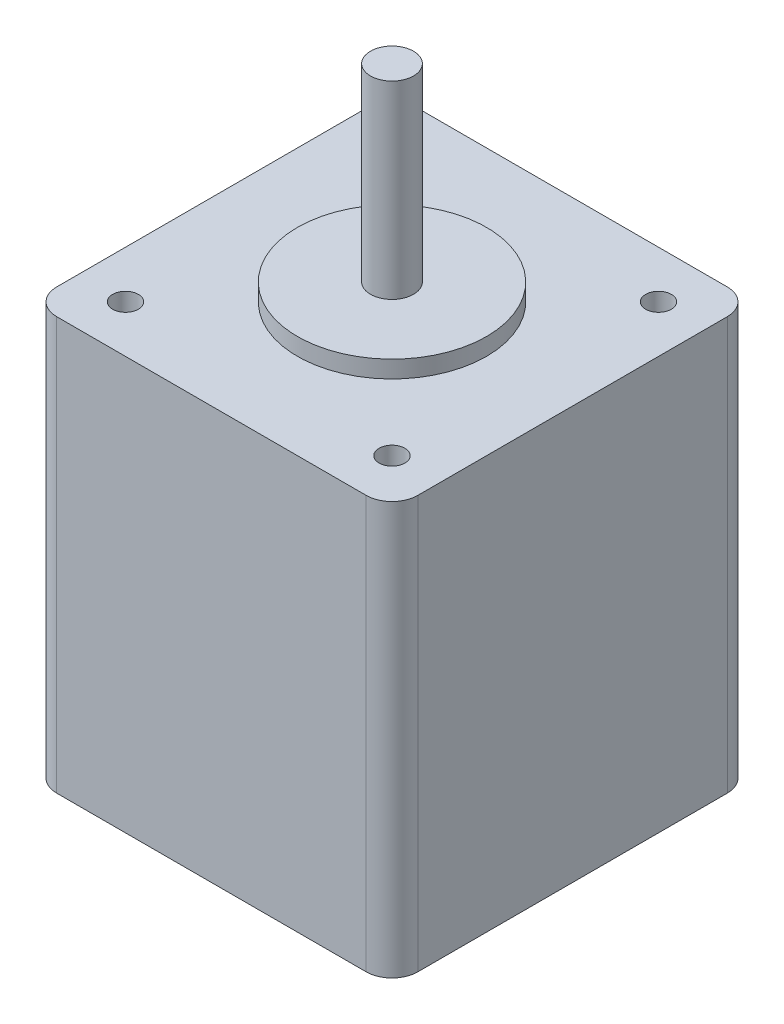
ISO-10303-21;
HEADER;
FILE_DESCRIPTION(('STEP AP214'),'2;1');
FILE_NAME('part.step','',(''),(''),'','','');
FILE_SCHEMA(('AUTOMOTIVE_DESIGN { 1 0 10303 214 1 1 1 1 }'));
ENDSEC;
DATA;
#1=APPLICATION_CONTEXT('core data for automotive mechanical design processes');
#2=APPLICATION_PROTOCOL_DEFINITION('international standard','automotive_design',2000,#1);
#3=PRODUCT_CONTEXT('',#1,'mechanical');
#4=PRODUCT('Part','Part','',(#3));
#5=PRODUCT_RELATED_PRODUCT_CATEGORY('part','',(#4));
#6=PRODUCT_DEFINITION_FORMATION('','',#4);
#7=PRODUCT_DEFINITION_CONTEXT('part definition',#1,'design');
#8=PRODUCT_DEFINITION('design','',#6,#7);
#9=PRODUCT_DEFINITION_SHAPE('','',#8);
#10=(LENGTH_UNIT() NAMED_UNIT(*) SI_UNIT(.MILLI.,.METRE.));
#11=(NAMED_UNIT(*) PLANE_ANGLE_UNIT() SI_UNIT($,.RADIAN.));
#12=(NAMED_UNIT(*) SI_UNIT($,.STERADIAN.) SOLID_ANGLE_UNIT());
#13=UNCERTAINTY_MEASURE_WITH_UNIT(LENGTH_MEASURE(1.E-05),#10,'distance_accuracy_value','');
#14=(GEOMETRIC_REPRESENTATION_CONTEXT(3) GLOBAL_UNCERTAINTY_ASSIGNED_CONTEXT((#13)) GLOBAL_UNIT_ASSIGNED_CONTEXT((#10,
#11,#12)) REPRESENTATION_CONTEXT('',''));
#15=CARTESIAN_POINT('',(0.,0.,0.));
#16=DIRECTION('',(0.,0.,1.));
#17=DIRECTION('',(1.,0.,0.));
#18=AXIS2_PLACEMENT_3D('',#15,#16,#17);
#19=CARTESIAN_POINT('',(0.,48.,0.));
#20=DIRECTION('',(0.,1.,0.));
#21=DIRECTION('',(1.,0.,0.));
#22=AXIS2_PLACEMENT_3D('',#19,#20,#21);
#23=PLANE('',#22);
#24=CARTESIAN_POINT('',(0.,48.,0.));
#25=DIRECTION('',(0.,-1.,0.));
#26=DIRECTION('',(-1.,0.,0.));
#27=AXIS2_PLACEMENT_3D('',#24,#25,#26);
#28=CIRCLE('',#27,11.);
#29=CARTESIAN_POINT('',(11.,48.,0.));
#30=VERTEX_POINT('',#29);
#31=EDGE_CURVE('E180',#30,#30,#28,.T.);
#32=ORIENTED_EDGE('',*,*,#31,.T.);
#33=EDGE_LOOP('',(#32));
#34=FACE_BOUND('',#33,.T.);
#35=CARTESIAN_POINT('',(-15.4999999999997,48.,15.4999999999997));
#36=DIRECTION('',(0.,-1.,0.));
#37=DIRECTION('',(-1.,0.,0.));
#38=AXIS2_PLACEMENT_3D('',#35,#36,#37);
#39=CIRCLE('',#38,1.5);
#40=CARTESIAN_POINT('',(-13.9999999999997,48.,15.4999999999997));
#41=VERTEX_POINT('',#40);
#42=EDGE_CURVE('E244',#41,#41,#39,.T.);
#43=ORIENTED_EDGE('',*,*,#42,.T.);
#44=EDGE_LOOP('',(#43));
#45=FACE_BOUND('',#44,.T.);
#46=CARTESIAN_POINT('',(15.5,48.,15.5));
#47=DIRECTION('',(0.,-1.,0.));
#48=DIRECTION('',(-1.,0.,0.));
#49=AXIS2_PLACEMENT_3D('',#46,#47,#48);
#50=CIRCLE('',#49,1.5);
#51=CARTESIAN_POINT('',(17.,48.,15.5));
#52=VERTEX_POINT('',#51);
#53=EDGE_CURVE('E156',#52,#52,#50,.T.);
#54=ORIENTED_EDGE('',*,*,#53,.T.);
#55=EDGE_LOOP('',(#54));
#56=FACE_BOUND('',#55,.T.);
#57=CARTESIAN_POINT('',(-15.5,48.,-15.5));
#58=DIRECTION('',(0.,-1.,0.));
#59=DIRECTION('',(-1.,0.,0.));
#60=AXIS2_PLACEMENT_3D('',#57,#58,#59);
#61=CIRCLE('',#60,1.5);
#62=CARTESIAN_POINT('',(-14.,48.,-15.5));
#63=VERTEX_POINT('',#62);
#64=EDGE_CURVE('E237',#63,#63,#61,.T.);
#65=ORIENTED_EDGE('',*,*,#64,.T.);
#66=EDGE_LOOP('',(#65));
#67=FACE_BOUND('',#66,.T.);
#68=CARTESIAN_POINT('',(15.4999999999997,48.,-15.4999999999997));
#69=DIRECTION('',(0.,-1.,0.));
#70=DIRECTION('',(-1.,0.,0.));
#71=AXIS2_PLACEMENT_3D('',#68,#69,#70);
#72=CIRCLE('',#71,1.5);
#73=CARTESIAN_POINT('',(16.9999999999997,48.,-15.4999999999997));
#74=VERTEX_POINT('',#73);
#75=EDGE_CURVE('E214',#74,#74,#72,.T.);
#76=ORIENTED_EDGE('',*,*,#75,.T.);
#77=EDGE_LOOP('',(#76));
#78=FACE_BOUND('',#77,.T.);
#79=CARTESIAN_POINT('',(-18.,48.,-18.));
#80=DIRECTION('',(0.,-1.,0.));
#81=DIRECTION('',(-0.707106781186547,0.,-0.707106781186548));
#82=AXIS2_PLACEMENT_3D('',#79,#80,#81);
#83=CIRCLE('',#82,3.);
#84=CARTESIAN_POINT('',(-21.,48.,-18.));
#85=VERTEX_POINT('',#84);
#86=CARTESIAN_POINT('',(-18.,48.,-21.));
#87=VERTEX_POINT('',#86);
#88=EDGE_CURVE('E261',#85,#87,#83,.T.);
#89=ORIENTED_EDGE('',*,*,#88,.F.);
#90=DIRECTION('',(0.,0.,1.));
#91=VECTOR('',#90,1.);
#92=CARTESIAN_POINT('',(-21.,48.,21.));
#93=LINE('',#92,#91);
#94=CARTESIAN_POINT('',(-21.,48.,18.));
#95=VERTEX_POINT('',#94);
#96=EDGE_CURVE('E245',#85,#95,#93,.T.);
#97=ORIENTED_EDGE('',*,*,#96,.T.);
#98=CARTESIAN_POINT('',(-18.,48.,18.));
#99=DIRECTION('',(0.,-1.,0.));
#100=DIRECTION('',(-0.707106781186548,0.,0.707106781186548));
#101=AXIS2_PLACEMENT_3D('',#98,#99,#100);
#102=CIRCLE('',#101,3.);
#103=CARTESIAN_POINT('',(-18.,48.,21.));
#104=VERTEX_POINT('',#103);
#105=EDGE_CURVE('E263',#104,#95,#102,.T.);
#106=ORIENTED_EDGE('',*,*,#105,.F.);
#107=DIRECTION('',(1.,0.,0.));
#108=VECTOR('',#107,1.);
#109=CARTESIAN_POINT('',(21.,48.,21.));
#110=LINE('',#109,#108);
#111=CARTESIAN_POINT('',(18.,48.,21.));
#112=VERTEX_POINT('',#111);
#113=EDGE_CURVE('E250',#104,#112,#110,.T.);
#114=ORIENTED_EDGE('',*,*,#113,.T.);
#115=CARTESIAN_POINT('',(18.,48.,18.));
#116=DIRECTION('',(0.,-1.,0.));
#117=DIRECTION('',(0.707106781186547,0.,0.707106781186548));
#118=AXIS2_PLACEMENT_3D('',#115,#116,#117);
#119=CIRCLE('',#118,3.);
#120=CARTESIAN_POINT('',(21.,48.,18.));
#121=VERTEX_POINT('',#120);
#122=EDGE_CURVE('E201',#121,#112,#119,.T.);
#123=ORIENTED_EDGE('',*,*,#122,.F.);
#124=DIRECTION('',(0.,0.,-1.));
#125=VECTOR('',#124,1.);
#126=CARTESIAN_POINT('',(21.,48.,-21.));
#127=LINE('',#126,#125);
#128=CARTESIAN_POINT('',(21.,48.,-18.));
#129=VERTEX_POINT('',#128);
#130=EDGE_CURVE('E11',#121,#129,#127,.T.);
#131=ORIENTED_EDGE('',*,*,#130,.T.);
#132=CARTESIAN_POINT('',(18.,48.,-18.));
#133=DIRECTION('',(0.,-1.,0.));
#134=DIRECTION('',(0.707106781186548,0.,-0.707106781186548));
#135=AXIS2_PLACEMENT_3D('',#132,#133,#134);
#136=CIRCLE('',#135,3.);
#137=CARTESIAN_POINT('',(18.,48.,-21.));
#138=VERTEX_POINT('',#137);
#139=EDGE_CURVE('E21',#138,#129,#136,.T.);
#140=ORIENTED_EDGE('',*,*,#139,.F.);
#141=DIRECTION('',(-1.,0.,0.));
#142=VECTOR('',#141,1.);
#143=CARTESIAN_POINT('',(-21.,48.,-21.));
#144=LINE('',#143,#142);
#145=EDGE_CURVE('E199',#138,#87,#144,.T.);
#146=ORIENTED_EDGE('',*,*,#145,.T.);
#147=EDGE_LOOP('',(#89,#97,#106,#114,#123,#131,#140,#146));
#148=FACE_BOUND('',#147,.T.);
#149=ADVANCED_FACE('F17',(#34,#45,#56,#67,#78,#148),#23,.T.);
#150=CARTESIAN_POINT('',(21.,0.,21.));
#151=DIRECTION('',(1.,0.,0.));
#152=DIRECTION('',(0.,1.,0.));
#153=AXIS2_PLACEMENT_3D('',#150,#151,#152);
#154=PLANE('',#153);
#155=DIRECTION('',(0.,-1.,0.));
#156=VECTOR('',#155,1.);
#157=CARTESIAN_POINT('',(21.,0.,-18.));
#158=LINE('',#157,#156);
#159=CARTESIAN_POINT('',(21.,0.,-18.));
#160=VERTEX_POINT('',#159);
#161=EDGE_CURVE('E231',#129,#160,#158,.T.);
#162=ORIENTED_EDGE('',*,*,#161,.F.);
#163=ORIENTED_EDGE('',*,*,#130,.F.);
#164=DIRECTION('',(0.,1.,0.));
#165=VECTOR('',#164,1.);
#166=CARTESIAN_POINT('',(21.,0.,18.));
#167=LINE('',#166,#165);
#168=CARTESIAN_POINT('',(21.,0.,18.));
#169=VERTEX_POINT('',#168);
#170=EDGE_CURVE('E28',#169,#121,#167,.T.);
#171=ORIENTED_EDGE('',*,*,#170,.F.);
#172=DIRECTION('',(0.,0.,1.));
#173=VECTOR('',#172,1.);
#174=CARTESIAN_POINT('',(21.,0.,-21.));
#175=LINE('',#174,#173);
#176=EDGE_CURVE('E182',#160,#169,#175,.T.);
#177=ORIENTED_EDGE('',*,*,#176,.F.);
#178=EDGE_LOOP('',(#162,#163,#171,#177));
#179=FACE_BOUND('',#178,.T.);
#180=ADVANCED_FACE('F636',(#179),#154,.T.);
#181=CARTESIAN_POINT('',(18.,0.,18.));
#182=DIRECTION('',(0.,1.,0.));
#183=DIRECTION('',(0.707106781186547,0.,0.707106781186548));
#184=AXIS2_PLACEMENT_3D('',#181,#182,#183);
#185=CYLINDRICAL_SURFACE('',#184,3.);
#186=ORIENTED_EDGE('',*,*,#122,.T.);
#187=DIRECTION('',(0.,-1.,0.));
#188=VECTOR('',#187,1.);
#189=CARTESIAN_POINT('',(18.,0.,21.));
#190=LINE('',#189,#188);
#191=CARTESIAN_POINT('',(18.,0.,21.));
#192=VERTEX_POINT('',#191);
#193=EDGE_CURVE('E77',#112,#192,#190,.T.);
#194=ORIENTED_EDGE('',*,*,#193,.T.);
#195=CARTESIAN_POINT('',(18.,0.,18.));
#196=DIRECTION('',(0.,1.,0.));
#197=DIRECTION('',(0.707106781186547,0.,0.707106781186548));
#198=AXIS2_PLACEMENT_3D('',#195,#196,#197);
#199=CIRCLE('',#198,3.);
#200=EDGE_CURVE('E186',#192,#169,#199,.T.);
#201=ORIENTED_EDGE('',*,*,#200,.T.);
#202=ORIENTED_EDGE('',*,*,#170,.T.);
#203=EDGE_LOOP('',(#186,#194,#201,#202));
#204=FACE_BOUND('',#203,.T.);
#205=ADVANCED_FACE('F628',(#204),#185,.T.);
#206=CARTESIAN_POINT('',(21.,0.,-21.));
#207=DIRECTION('',(0.,0.,-1.));
#208=DIRECTION('',(0.,-1.,0.));
#209=AXIS2_PLACEMENT_3D('',#206,#207,#208);
#210=PLANE('',#209);
#211=DIRECTION('',(0.,-1.,0.));
#212=VECTOR('',#211,1.);
#213=CARTESIAN_POINT('',(-18.,0.,-21.));
#214=LINE('',#213,#212);
#215=CARTESIAN_POINT('',(-18.,0.,-21.));
#216=VERTEX_POINT('',#215);
#217=EDGE_CURVE('E230',#87,#216,#214,.T.);
#218=ORIENTED_EDGE('',*,*,#217,.F.);
#219=ORIENTED_EDGE('',*,*,#145,.F.);
#220=DIRECTION('',(0.,1.,0.));
#221=VECTOR('',#220,1.);
#222=CARTESIAN_POINT('',(18.,0.,-21.));
#223=LINE('',#222,#221);
#224=CARTESIAN_POINT('',(18.,0.,-21.));
#225=VERTEX_POINT('',#224);
#226=EDGE_CURVE('E202',#225,#138,#223,.T.);
#227=ORIENTED_EDGE('',*,*,#226,.F.);
#228=DIRECTION('',(1.,0.,0.));
#229=VECTOR('',#228,1.);
#230=CARTESIAN_POINT('',(-21.,0.,-21.));
#231=LINE('',#230,#229);
#232=EDGE_CURVE('E249',#216,#225,#231,.T.);
#233=ORIENTED_EDGE('',*,*,#232,.F.);
#234=EDGE_LOOP('',(#218,#219,#227,#233));
#235=FACE_BOUND('',#234,.T.);
#236=ADVANCED_FACE('F327',(#235),#210,.T.);
#237=CARTESIAN_POINT('',(18.,0.,-18.));
#238=DIRECTION('',(0.,1.,0.));
#239=DIRECTION('',(0.707106781186548,0.,-0.707106781186548));
#240=AXIS2_PLACEMENT_3D('',#237,#238,#239);
#241=CYLINDRICAL_SURFACE('',#240,3.);
#242=ORIENTED_EDGE('',*,*,#139,.T.);
#243=ORIENTED_EDGE('',*,*,#161,.T.);
#244=CARTESIAN_POINT('',(18.,0.,-18.));
#245=DIRECTION('',(0.,1.,0.));
#246=DIRECTION('',(0.707106781186548,0.,-0.707106781186548));
#247=AXIS2_PLACEMENT_3D('',#244,#245,#246);
#248=CIRCLE('',#247,3.);
#249=EDGE_CURVE('E187',#160,#225,#248,.T.);
#250=ORIENTED_EDGE('',*,*,#249,.T.);
#251=ORIENTED_EDGE('',*,*,#226,.T.);
#252=EDGE_LOOP('',(#242,#243,#250,#251));
#253=FACE_BOUND('',#252,.T.);
#254=ADVANCED_FACE('F321',(#253),#241,.T.);
#255=CARTESIAN_POINT('',(-21.,0.,21.));
#256=DIRECTION('',(0.,0.,1.));
#257=DIRECTION('',(1.,0.,0.));
#258=AXIS2_PLACEMENT_3D('',#255,#256,#257);
#259=PLANE('',#258);
#260=DIRECTION('',(0.,1.,0.));
#261=VECTOR('',#260,1.);
#262=CARTESIAN_POINT('',(-18.,0.,21.));
#263=LINE('',#262,#261);
#264=CARTESIAN_POINT('',(-18.,0.,21.));
#265=VERTEX_POINT('',#264);
#266=EDGE_CURVE('E88',#265,#104,#263,.T.);
#267=ORIENTED_EDGE('',*,*,#266,.F.);
#268=DIRECTION('',(-1.,0.,0.));
#269=VECTOR('',#268,1.);
#270=CARTESIAN_POINT('',(21.,0.,21.));
#271=LINE('',#270,#269);
#272=EDGE_CURVE('E190',#192,#265,#271,.T.);
#273=ORIENTED_EDGE('',*,*,#272,.F.);
#274=ORIENTED_EDGE('',*,*,#193,.F.);
#275=ORIENTED_EDGE('',*,*,#113,.F.);
#276=EDGE_LOOP('',(#267,#273,#274,#275));
#277=FACE_BOUND('',#276,.T.);
#278=ADVANCED_FACE('F288',(#277),#259,.T.);
#279=CARTESIAN_POINT('',(-18.,0.,18.));
#280=DIRECTION('',(0.,1.,0.));
#281=DIRECTION('',(-0.707106781186548,0.,0.707106781186548));
#282=AXIS2_PLACEMENT_3D('',#279,#280,#281);
#283=CYLINDRICAL_SURFACE('',#282,3.);
#284=ORIENTED_EDGE('',*,*,#105,.T.);
#285=DIRECTION('',(0.,-1.,0.));
#286=VECTOR('',#285,1.);
#287=CARTESIAN_POINT('',(-21.,0.,18.));
#288=LINE('',#287,#286);
#289=CARTESIAN_POINT('',(-21.,0.,18.));
#290=VERTEX_POINT('',#289);
#291=EDGE_CURVE('E194',#95,#290,#288,.T.);
#292=ORIENTED_EDGE('',*,*,#291,.T.);
#293=CARTESIAN_POINT('',(-18.,0.,18.));
#294=DIRECTION('',(0.,1.,0.));
#295=DIRECTION('',(-0.707106781186548,0.,0.707106781186548));
#296=AXIS2_PLACEMENT_3D('',#293,#294,#295);
#297=CIRCLE('',#296,3.);
#298=EDGE_CURVE('E222',#290,#265,#297,.T.);
#299=ORIENTED_EDGE('',*,*,#298,.T.);
#300=ORIENTED_EDGE('',*,*,#266,.T.);
#301=EDGE_LOOP('',(#284,#292,#299,#300));
#302=FACE_BOUND('',#301,.T.);
#303=ADVANCED_FACE('F278',(#302),#283,.T.);
#304=CARTESIAN_POINT('',(0.,0.,0.));
#305=DIRECTION('',(0.,1.,0.));
#306=DIRECTION('',(1.,0.,0.));
#307=AXIS2_PLACEMENT_3D('',#304,#305,#306);
#308=PLANE('',#307);
#309=CARTESIAN_POINT('',(-18.,0.,-18.));
#310=DIRECTION('',(0.,1.,0.));
#311=DIRECTION('',(-0.707106781186547,0.,-0.707106781186548));
#312=AXIS2_PLACEMENT_3D('',#309,#310,#311);
#313=CIRCLE('',#312,3.);
#314=CARTESIAN_POINT('',(-21.,0.,-18.));
#315=VERTEX_POINT('',#314);
#316=EDGE_CURVE('E213',#216,#315,#313,.T.);
#317=ORIENTED_EDGE('',*,*,#316,.F.);
#318=ORIENTED_EDGE('',*,*,#232,.T.);
#319=ORIENTED_EDGE('',*,*,#249,.F.);
#320=ORIENTED_EDGE('',*,*,#176,.T.);
#321=ORIENTED_EDGE('',*,*,#200,.F.);
#322=ORIENTED_EDGE('',*,*,#272,.T.);
#323=ORIENTED_EDGE('',*,*,#298,.F.);
#324=DIRECTION('',(0.,0.,-1.));
#325=VECTOR('',#324,1.);
#326=CARTESIAN_POINT('',(-21.,0.,21.));
#327=LINE('',#326,#325);
#328=EDGE_CURVE('E191',#290,#315,#327,.T.);
#329=ORIENTED_EDGE('',*,*,#328,.T.);
#330=EDGE_LOOP('',(#317,#318,#319,#320,#321,#322,#323,#329));
#331=FACE_BOUND('',#330,.T.);
#332=ADVANCED_FACE('F285',(#331),#308,.F.);
#333=CARTESIAN_POINT('',(-21.,0.,-21.));
#334=DIRECTION('',(-1.,0.,0.));
#335=DIRECTION('',(0.,0.,1.));
#336=AXIS2_PLACEMENT_3D('',#333,#334,#335);
#337=PLANE('',#336);
#338=DIRECTION('',(0.,1.,0.));
#339=VECTOR('',#338,1.);
#340=CARTESIAN_POINT('',(-21.,0.,-18.));
#341=LINE('',#340,#339);
#342=EDGE_CURVE('E195',#315,#85,#341,.T.);
#343=ORIENTED_EDGE('',*,*,#342,.F.);
#344=ORIENTED_EDGE('',*,*,#328,.F.);
#345=ORIENTED_EDGE('',*,*,#291,.F.);
#346=ORIENTED_EDGE('',*,*,#96,.F.);
#347=EDGE_LOOP('',(#343,#344,#345,#346));
#348=FACE_BOUND('',#347,.T.);
#349=ADVANCED_FACE('F282',(#348),#337,.T.);
#350=CARTESIAN_POINT('',(-18.,0.,-18.));
#351=DIRECTION('',(0.,1.,0.));
#352=DIRECTION('',(-0.707106781186547,0.,-0.707106781186548));
#353=AXIS2_PLACEMENT_3D('',#350,#351,#352);
#354=CYLINDRICAL_SURFACE('',#353,3.);
#355=ORIENTED_EDGE('',*,*,#88,.T.);
#356=ORIENTED_EDGE('',*,*,#217,.T.);
#357=ORIENTED_EDGE('',*,*,#316,.T.);
#358=ORIENTED_EDGE('',*,*,#342,.T.);
#359=EDGE_LOOP('',(#355,#356,#357,#358));
#360=FACE_BOUND('',#359,.T.);
#361=ADVANCED_FACE('F573',(#360),#354,.T.);
#362=CARTESIAN_POINT('',(0.,50.,0.));
#363=DIRECTION('',(0.,1.,0.));
#364=DIRECTION('',(1.,0.,0.));
#365=AXIS2_PLACEMENT_3D('',#362,#363,#364);
#366=PLANE('',#365);
#367=CARTESIAN_POINT('',(0.,50.,0.));
#368=DIRECTION('',(0.,-1.,0.));
#369=DIRECTION('',(-1.,0.,0.));
#370=AXIS2_PLACEMENT_3D('',#367,#368,#369);
#371=CIRCLE('',#370,2.5);
#372=CARTESIAN_POINT('',(2.5,50.,0.));
#373=VERTEX_POINT('',#372);
#374=EDGE_CURVE('E174',#373,#373,#371,.T.);
#375=ORIENTED_EDGE('',*,*,#374,.T.);
#376=EDGE_LOOP('',(#375));
#377=FACE_BOUND('',#376,.T.);
#378=CARTESIAN_POINT('',(0.,50.,0.));
#379=DIRECTION('',(0.,1.,0.));
#380=DIRECTION('',(-1.,0.,0.));
#381=AXIS2_PLACEMENT_3D('',#378,#379,#380);
#382=CIRCLE('',#381,11.);
#383=CARTESIAN_POINT('',(11.,50.,0.));
#384=VERTEX_POINT('',#383);
#385=EDGE_CURVE('E181',#384,#384,#382,.T.);
#386=ORIENTED_EDGE('',*,*,#385,.T.);
#387=EDGE_LOOP('',(#386));
#388=FACE_BOUND('',#387,.T.);
#389=ADVANCED_FACE('F562',(#377,#388),#366,.T.);
#390=CARTESIAN_POINT('',(0.,48.,0.));
#391=DIRECTION('',(0.,1.,0.));
#392=DIRECTION('',(-1.,0.,0.));
#393=AXIS2_PLACEMENT_3D('',#390,#391,#392);
#394=CYLINDRICAL_SURFACE('',#393,11.);
#395=ORIENTED_EDGE('',*,*,#385,.F.);
#396=DIRECTION('',(0.,-1.,0.));
#397=VECTOR('',#396,1.);
#398=CARTESIAN_POINT('',(11.,48.,0.));
#399=LINE('',#398,#397);
#400=EDGE_CURVE('E176',#384,#30,#399,.T.);
#401=ORIENTED_EDGE('',*,*,#400,.T.);
#402=ORIENTED_EDGE('',*,*,#31,.F.);
#403=ORIENTED_EDGE('',*,*,#400,.F.);
#404=EDGE_LOOP('',(#395,#401,#402,#403));
#405=FACE_BOUND('',#404,.T.);
#406=ADVANCED_FACE('F551',(#405),#394,.T.);
#407=CARTESIAN_POINT('',(0.,72.,0.));
#408=DIRECTION('',(0.,1.,0.));
#409=DIRECTION('',(1.,0.,0.));
#410=AXIS2_PLACEMENT_3D('',#407,#408,#409);
#411=PLANE('',#410);
#412=CARTESIAN_POINT('',(0.,72.,0.));
#413=DIRECTION('',(0.,1.,0.));
#414=DIRECTION('',(-1.,0.,0.));
#415=AXIS2_PLACEMENT_3D('',#412,#413,#414);
#416=CIRCLE('',#415,2.5);
#417=CARTESIAN_POINT('',(2.5,72.,0.));
#418=VERTEX_POINT('',#417);
#419=EDGE_CURVE('E208',#418,#418,#416,.T.);
#420=ORIENTED_EDGE('',*,*,#419,.T.);
#421=EDGE_LOOP('',(#420));
#422=FACE_BOUND('',#421,.T.);
#423=ADVANCED_FACE('F542',(#422),#411,.T.);
#424=CARTESIAN_POINT('',(0.,50.,0.));
#425=DIRECTION('',(0.,1.,0.));
#426=DIRECTION('',(-1.,0.,0.));
#427=AXIS2_PLACEMENT_3D('',#424,#425,#426);
#428=CYLINDRICAL_SURFACE('',#427,2.5);
#429=ORIENTED_EDGE('',*,*,#419,.F.);
#430=DIRECTION('',(0.,-1.,0.));
#431=VECTOR('',#430,1.);
#432=CARTESIAN_POINT('',(2.5,50.,0.));
#433=LINE('',#432,#431);
#434=EDGE_CURVE('E223',#418,#373,#433,.T.);
#435=ORIENTED_EDGE('',*,*,#434,.T.);
#436=ORIENTED_EDGE('',*,*,#374,.F.);
#437=ORIENTED_EDGE('',*,*,#434,.F.);
#438=EDGE_LOOP('',(#429,#435,#436,#437));
#439=FACE_BOUND('',#438,.T.);
#440=ADVANCED_FACE('F532',(#439),#428,.T.);
#441=CARTESIAN_POINT('',(-15.4999999999997,43.5,15.4999999999997));
#442=DIRECTION('',(0.,1.,0.));
#443=DIRECTION('',(1.,0.,0.));
#444=AXIS2_PLACEMENT_3D('',#441,#442,#443);
#445=PLANE('',#444);
#446=CARTESIAN_POINT('',(-15.4999999999997,43.5,15.4999999999997));
#447=DIRECTION('',(0.,-1.,0.));
#448=DIRECTION('',(-1.,0.,0.));
#449=AXIS2_PLACEMENT_3D('',#446,#447,#448);
#450=CIRCLE('',#449,1.5);
#451=CARTESIAN_POINT('',(-13.9999999999997,43.5,15.4999999999997));
#452=VERTEX_POINT('',#451);
#453=EDGE_CURVE('E204',#452,#452,#450,.T.);
#454=ORIENTED_EDGE('',*,*,#453,.F.);
#455=EDGE_LOOP('',(#454));
#456=FACE_BOUND('',#455,.T.);
#457=ADVANCED_FACE('F521',(#456),#445,.T.);
#458=CARTESIAN_POINT('',(-15.4999999999997,48.,15.4999999999997));
#459=DIRECTION('',(0.,-1.,0.));
#460=DIRECTION('',(-1.,0.,0.));
#461=AXIS2_PLACEMENT_3D('',#458,#459,#460);
#462=CYLINDRICAL_SURFACE('',#461,1.5);
#463=ORIENTED_EDGE('',*,*,#42,.F.);
#464=DIRECTION('',(0.,-1.,0.));
#465=VECTOR('',#464,1.);
#466=CARTESIAN_POINT('',(-13.9999999999997,48.,15.4999999999997));
#467=LINE('',#466,#465);
#468=EDGE_CURVE('E209',#41,#452,#467,.T.);
#469=ORIENTED_EDGE('',*,*,#468,.T.);
#470=ORIENTED_EDGE('',*,*,#453,.T.);
#471=ORIENTED_EDGE('',*,*,#468,.F.);
#472=EDGE_LOOP('',(#463,#469,#470,#471));
#473=FACE_BOUND('',#472,.T.);
#474=ADVANCED_FACE('F512',(#473),#462,.F.);
#475=CARTESIAN_POINT('',(15.5,43.5,15.5));
#476=DIRECTION('',(0.,1.,0.));
#477=DIRECTION('',(1.,0.,0.));
#478=AXIS2_PLACEMENT_3D('',#475,#476,#477);
#479=PLANE('',#478);
#480=CARTESIAN_POINT('',(15.5,43.5,15.5));
#481=DIRECTION('',(0.,-1.,0.));
#482=DIRECTION('',(-1.,0.,0.));
#483=AXIS2_PLACEMENT_3D('',#480,#481,#482);
#484=CIRCLE('',#483,1.5);
#485=CARTESIAN_POINT('',(17.,43.5,15.5));
#486=VERTEX_POINT('',#485);
#487=EDGE_CURVE('E158',#486,#486,#484,.T.);
#488=ORIENTED_EDGE('',*,*,#487,.F.);
#489=EDGE_LOOP('',(#488));
#490=FACE_BOUND('',#489,.T.);
#491=ADVANCED_FACE('F19',(#490),#479,.T.);
#492=CARTESIAN_POINT('',(15.5,48.,15.5));
#493=DIRECTION('',(0.,-1.,0.));
#494=DIRECTION('',(-1.,0.,0.));
#495=AXIS2_PLACEMENT_3D('',#492,#493,#494);
#496=CYLINDRICAL_SURFACE('',#495,1.5);
#497=ORIENTED_EDGE('',*,*,#53,.F.);
#498=DIRECTION('',(0.,-1.,0.));
#499=VECTOR('',#498,1.);
#500=CARTESIAN_POINT('',(17.,48.,15.5));
#501=LINE('',#500,#499);
#502=EDGE_CURVE('E153',#52,#486,#501,.T.);
#503=ORIENTED_EDGE('',*,*,#502,.T.);
#504=ORIENTED_EDGE('',*,*,#487,.T.);
#505=ORIENTED_EDGE('',*,*,#502,.F.);
#506=EDGE_LOOP('',(#497,#503,#504,#505));
#507=FACE_BOUND('',#506,.T.);
#508=ADVANCED_FACE('F155',(#507),#496,.F.);
#509=CARTESIAN_POINT('',(-15.5,43.5,-15.5));
#510=DIRECTION('',(0.,1.,0.));
#511=DIRECTION('',(1.,0.,0.));
#512=AXIS2_PLACEMENT_3D('',#509,#510,#511);
#513=PLANE('',#512);
#514=CARTESIAN_POINT('',(-15.5,43.5,-15.5));
#515=DIRECTION('',(0.,-1.,0.));
#516=DIRECTION('',(-1.,0.,0.));
#517=AXIS2_PLACEMENT_3D('',#514,#515,#516);
#518=CIRCLE('',#517,1.5);
#519=CARTESIAN_POINT('',(-14.,43.5,-15.5));
#520=VERTEX_POINT('',#519);
#521=EDGE_CURVE('E164',#520,#520,#518,.T.);
#522=ORIENTED_EDGE('',*,*,#521,.F.);
#523=EDGE_LOOP('',(#522));
#524=FACE_BOUND('',#523,.T.);
#525=ADVANCED_FACE('F483',(#524),#513,.T.);
#526=CARTESIAN_POINT('',(-15.5,48.,-15.5));
#527=DIRECTION('',(0.,-1.,0.));
#528=DIRECTION('',(-1.,0.,0.));
#529=AXIS2_PLACEMENT_3D('',#526,#527,#528);
#530=CYLINDRICAL_SURFACE('',#529,1.5);
#531=ORIENTED_EDGE('',*,*,#64,.F.);
#532=DIRECTION('',(0.,-1.,0.));
#533=VECTOR('',#532,1.);
#534=CARTESIAN_POINT('',(-14.,48.,-15.5));
#535=LINE('',#534,#533);
#536=EDGE_CURVE('E170',#63,#520,#535,.T.);
#537=ORIENTED_EDGE('',*,*,#536,.T.);
#538=ORIENTED_EDGE('',*,*,#521,.T.);
#539=ORIENTED_EDGE('',*,*,#536,.F.);
#540=EDGE_LOOP('',(#531,#537,#538,#539));
#541=FACE_BOUND('',#540,.T.);
#542=ADVANCED_FACE('F473',(#541),#530,.F.);
#543=CARTESIAN_POINT('',(15.4999999999997,43.5,-15.4999999999997));
#544=DIRECTION('',(0.,1.,0.));
#545=DIRECTION('',(1.,0.,0.));
#546=AXIS2_PLACEMENT_3D('',#543,#544,#545);
#547=PLANE('',#546);
#548=CARTESIAN_POINT('',(15.4999999999997,43.5,-15.4999999999997));
#549=DIRECTION('',(0.,-1.,0.));
#550=DIRECTION('',(-1.,0.,0.));
#551=AXIS2_PLACEMENT_3D('',#548,#549,#550);
#552=CIRCLE('',#551,1.5);
#553=CARTESIAN_POINT('',(16.9999999999997,43.5,-15.4999999999997));
#554=VERTEX_POINT('',#553);
#555=EDGE_CURVE('E241',#554,#554,#552,.T.);
#556=ORIENTED_EDGE('',*,*,#555,.F.);
#557=EDGE_LOOP('',(#556));
#558=FACE_BOUND('',#557,.T.);
#559=ADVANCED_FACE('F461',(#558),#547,.T.);
#560=CARTESIAN_POINT('',(15.4999999999997,48.,-15.4999999999997));
#561=DIRECTION('',(0.,-1.,0.));
#562=DIRECTION('',(-1.,0.,0.));
#563=AXIS2_PLACEMENT_3D('',#560,#561,#562);
#564=CYLINDRICAL_SURFACE('',#563,1.5);
#565=ORIENTED_EDGE('',*,*,#75,.F.);
#566=DIRECTION('',(0.,-1.,0.));
#567=VECTOR('',#566,1.);
#568=CARTESIAN_POINT('',(16.9999999999997,48.,-15.4999999999997));
#569=LINE('',#568,#567);
#570=EDGE_CURVE('E218',#74,#554,#569,.T.);
#571=ORIENTED_EDGE('',*,*,#570,.T.);
#572=ORIENTED_EDGE('',*,*,#555,.T.);
#573=ORIENTED_EDGE('',*,*,#570,.F.);
#574=EDGE_LOOP('',(#565,#571,#572,#573));
#575=FACE_BOUND('',#574,.T.);
#576=ADVANCED_FACE('F453',(#575),#564,.F.);
#577=CLOSED_SHELL('',(#149,#180,#205,#236,#254,#278,#303,#332,#349,#361,#389,#406,#423,#440,
#457,#474,#491,#508,#525,#542,#559,#576));
#578=MANIFOLD_SOLID_BREP('B1',#577);
#579=ADVANCED_BREP_SHAPE_REPRESENTATION('',(#18,#578),#14);
#580=SHAPE_DEFINITION_REPRESENTATION(#9,#579);
ENDSEC;
END-ISO-10303-21;
